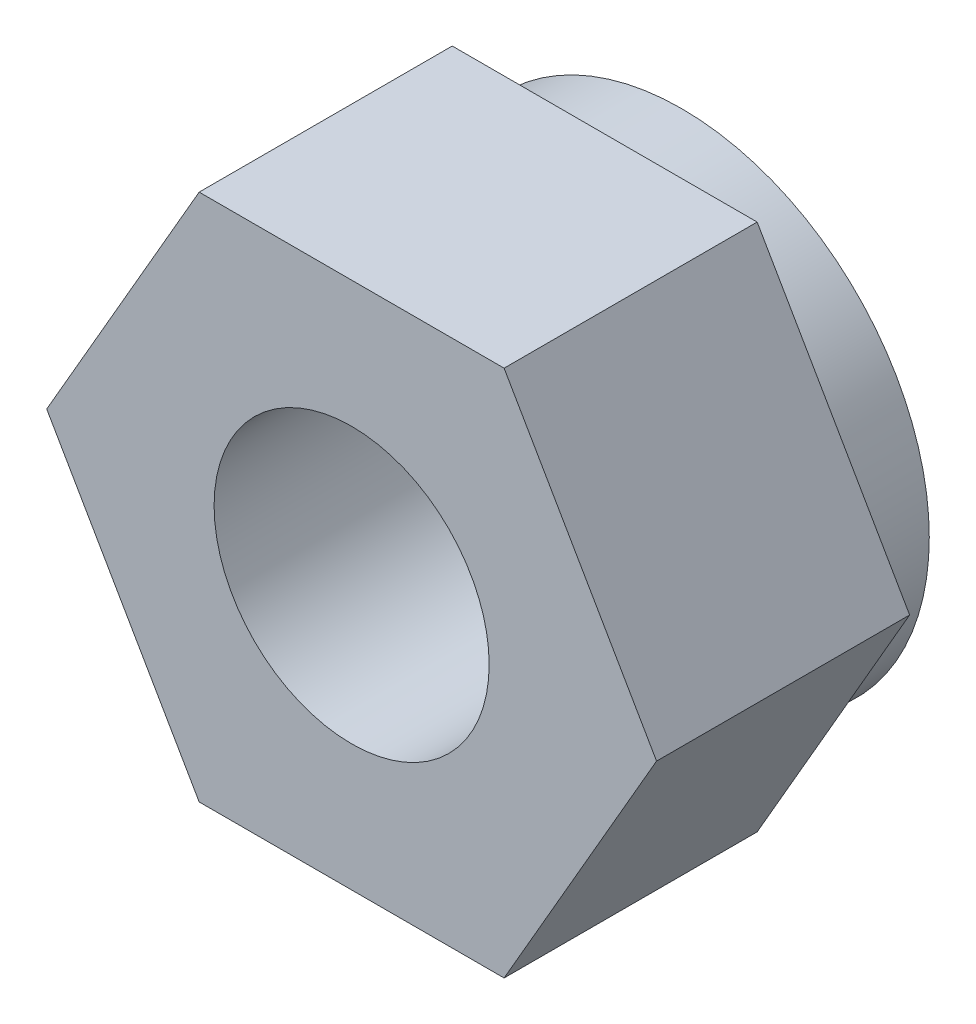
ISO-10303-21;
HEADER;
FILE_DESCRIPTION(('STEP AP214'),'2;1');
FILE_NAME('part.step','',(''),(''),'','','');
FILE_SCHEMA(('AUTOMOTIVE_DESIGN { 1 0 10303 214 1 1 1 1 }'));
ENDSEC;
DATA;
#1=APPLICATION_CONTEXT('core data for automotive mechanical design processes');
#2=APPLICATION_PROTOCOL_DEFINITION('international standard','automotive_design',2000,#1);
#3=PRODUCT_CONTEXT('',#1,'mechanical');
#4=PRODUCT('Part','Part','',(#3));
#5=PRODUCT_RELATED_PRODUCT_CATEGORY('part','',(#4));
#6=PRODUCT_DEFINITION_FORMATION('','',#4);
#7=PRODUCT_DEFINITION_CONTEXT('part definition',#1,'design');
#8=PRODUCT_DEFINITION('design','',#6,#7);
#9=PRODUCT_DEFINITION_SHAPE('','',#8);
#10=(LENGTH_UNIT() NAMED_UNIT(*) SI_UNIT(.MILLI.,.METRE.));
#11=(NAMED_UNIT(*) PLANE_ANGLE_UNIT() SI_UNIT($,.RADIAN.));
#12=(NAMED_UNIT(*) SI_UNIT($,.STERADIAN.) SOLID_ANGLE_UNIT());
#13=UNCERTAINTY_MEASURE_WITH_UNIT(LENGTH_MEASURE(1.E-05),#10,'distance_accuracy_value','');
#14=(GEOMETRIC_REPRESENTATION_CONTEXT(3) GLOBAL_UNCERTAINTY_ASSIGNED_CONTEXT((#13)) GLOBAL_UNIT_ASSIGNED_CONTEXT((#10,
#11,#12)) REPRESENTATION_CONTEXT('',''));
#15=CARTESIAN_POINT('',(0.,0.,0.));
#16=DIRECTION('',(0.,0.,1.));
#17=DIRECTION('',(1.,0.,0.));
#18=AXIS2_PLACEMENT_3D('',#15,#16,#17);
#19=CARTESIAN_POINT('',(0.,0.,2.3));
#20=DIRECTION('',(0.,0.,1.));
#21=DIRECTION('',(1.,0.,0.));
#22=AXIS2_PLACEMENT_3D('',#19,#20,#21);
#23=PLANE('',#22);
#24=DIRECTION('',(-1.,0.,0.));
#25=VECTOR('',#24,1.);
#26=CARTESIAN_POINT('',(1.3856406460551,2.4,2.3));
#27=LINE('',#26,#25);
#28=CARTESIAN_POINT('',(1.3856406460551,2.4,2.3));
#29=VERTEX_POINT('',#28);
#30=CARTESIAN_POINT('',(-1.3856406460551,2.4,2.3));
#31=VERTEX_POINT('',#30);
#32=EDGE_CURVE('E139',#29,#31,#27,.T.);
#33=ORIENTED_EDGE('',*,*,#32,.T.);
#34=DIRECTION('',(-0.5,-0.866025403784438,0.));
#35=VECTOR('',#34,1.);
#36=CARTESIAN_POINT('',(-1.3856406460551,2.4,2.3));
#37=LINE('',#36,#35);
#38=CARTESIAN_POINT('',(-2.77128129211021,0.,2.3));
#39=VERTEX_POINT('',#38);
#40=EDGE_CURVE('E97',#31,#39,#37,.T.);
#41=ORIENTED_EDGE('',*,*,#40,.T.);
#42=DIRECTION('',(0.5,-0.866025403784439,0.));
#43=VECTOR('',#42,1.);
#44=CARTESIAN_POINT('',(-2.77128129211021,0.,2.3));
#45=LINE('',#44,#43);
#46=CARTESIAN_POINT('',(-1.3856406460551,-2.4,2.3));
#47=VERTEX_POINT('',#46);
#48=EDGE_CURVE('E110',#39,#47,#45,.T.);
#49=ORIENTED_EDGE('',*,*,#48,.T.);
#50=DIRECTION('',(1.,0.,0.));
#51=VECTOR('',#50,1.);
#52=CARTESIAN_POINT('',(-1.3856406460551,-2.4,2.3));
#53=LINE('',#52,#51);
#54=CARTESIAN_POINT('',(1.3856406460551,-2.4,2.3));
#55=VERTEX_POINT('',#54);
#56=EDGE_CURVE('E104',#47,#55,#53,.T.);
#57=ORIENTED_EDGE('',*,*,#56,.T.);
#58=DIRECTION('',(0.5,0.866025403784439,0.));
#59=VECTOR('',#58,1.);
#60=CARTESIAN_POINT('',(1.3856406460551,-2.4,2.3));
#61=LINE('',#60,#59);
#62=CARTESIAN_POINT('',(2.77128129211021,0.,2.3));
#63=VERTEX_POINT('',#62);
#64=EDGE_CURVE('E108',#55,#63,#61,.T.);
#65=ORIENTED_EDGE('',*,*,#64,.T.);
#66=DIRECTION('',(-0.5,0.866025403784439,0.));
#67=VECTOR('',#66,1.);
#68=CARTESIAN_POINT('',(2.77128129211021,0.,2.3));
#69=LINE('',#68,#67);
#70=EDGE_CURVE('E59',#63,#29,#69,.T.);
#71=ORIENTED_EDGE('',*,*,#70,.T.);
#72=EDGE_LOOP('',(#33,#41,#49,#57,#65,#71));
#73=FACE_BOUND('',#72,.T.);
#74=CARTESIAN_POINT('',(0.,0.,2.3));
#75=DIRECTION('',(0.,0.,1.));
#76=DIRECTION('',(1.,0.,0.));
#77=AXIS2_PLACEMENT_3D('',#74,#75,#76);
#78=CIRCLE('',#77,1.25);
#79=CARTESIAN_POINT('',(1.25,0.,2.3));
#80=VERTEX_POINT('',#79);
#81=EDGE_CURVE('E132',#80,#80,#78,.T.);
#82=ORIENTED_EDGE('',*,*,#81,.F.);
#83=EDGE_LOOP('',(#82));
#84=FACE_BOUND('',#83,.T.);
#85=ADVANCED_FACE('F41',(#73,#84),#23,.T.);
#86=CARTESIAN_POINT('',(0.,0.,0.));
#87=DIRECTION('',(0.,0.,1.));
#88=DIRECTION('',(1.,0.,0.));
#89=AXIS2_PLACEMENT_3D('',#86,#87,#88);
#90=PLANE('',#89);
#91=CARTESIAN_POINT('',(0.,0.,0.));
#92=DIRECTION('',(0.,0.,-1.));
#93=DIRECTION('',(-1.,0.,0.));
#94=AXIS2_PLACEMENT_3D('',#91,#92,#93);
#95=CIRCLE('',#94,2.25);
#96=CARTESIAN_POINT('',(-2.25,0.,0.));
#97=VERTEX_POINT('',#96);
#98=EDGE_CURVE('E11',#97,#97,#95,.T.);
#99=ORIENTED_EDGE('',*,*,#98,.F.);
#100=EDGE_LOOP('',(#99));
#101=FACE_BOUND('',#100,.T.);
#102=DIRECTION('',(-1.,0.,0.));
#103=VECTOR('',#102,1.);
#104=CARTESIAN_POINT('',(1.3856406460551,2.4,0.));
#105=LINE('',#104,#103);
#106=CARTESIAN_POINT('',(1.3856406460551,2.4,0.));
#107=VERTEX_POINT('',#106);
#108=CARTESIAN_POINT('',(-1.3856406460551,2.4,0.));
#109=VERTEX_POINT('',#108);
#110=EDGE_CURVE('E128',#107,#109,#105,.T.);
#111=ORIENTED_EDGE('',*,*,#110,.F.);
#112=DIRECTION('',(-0.5,0.866025403784439,0.));
#113=VECTOR('',#112,1.);
#114=CARTESIAN_POINT('',(2.77128129211021,0.,0.));
#115=LINE('',#114,#113);
#116=CARTESIAN_POINT('',(2.77128129211021,0.,0.));
#117=VERTEX_POINT('',#116);
#118=EDGE_CURVE('E88',#117,#107,#115,.T.);
#119=ORIENTED_EDGE('',*,*,#118,.F.);
#120=DIRECTION('',(0.5,0.866025403784439,0.));
#121=VECTOR('',#120,1.);
#122=CARTESIAN_POINT('',(1.3856406460551,-2.4,0.));
#123=LINE('',#122,#121);
#124=CARTESIAN_POINT('',(1.3856406460551,-2.4,0.));
#125=VERTEX_POINT('',#124);
#126=EDGE_CURVE('E82',#125,#117,#123,.T.);
#127=ORIENTED_EDGE('',*,*,#126,.F.);
#128=DIRECTION('',(1.,0.,0.));
#129=VECTOR('',#128,1.);
#130=CARTESIAN_POINT('',(-1.3856406460551,-2.4,0.));
#131=LINE('',#130,#129);
#132=CARTESIAN_POINT('',(-1.3856406460551,-2.4,0.));
#133=VERTEX_POINT('',#132);
#134=EDGE_CURVE('E118',#133,#125,#131,.T.);
#135=ORIENTED_EDGE('',*,*,#134,.F.);
#136=DIRECTION('',(0.5,-0.866025403784439,0.));
#137=VECTOR('',#136,1.);
#138=CARTESIAN_POINT('',(-2.77128129211021,0.,0.));
#139=LINE('',#138,#137);
#140=CARTESIAN_POINT('',(-2.77128129211021,0.,0.));
#141=VERTEX_POINT('',#140);
#142=EDGE_CURVE('E134',#141,#133,#139,.T.);
#143=ORIENTED_EDGE('',*,*,#142,.F.);
#144=DIRECTION('',(-0.5,-0.866025403784438,0.));
#145=VECTOR('',#144,1.);
#146=CARTESIAN_POINT('',(-1.3856406460551,2.4,0.));
#147=LINE('',#146,#145);
#148=EDGE_CURVE('E131',#109,#141,#147,.T.);
#149=ORIENTED_EDGE('',*,*,#148,.F.);
#150=EDGE_LOOP('',(#111,#119,#127,#135,#143,#149));
#151=FACE_BOUND('',#150,.T.);
#152=ADVANCED_FACE('F152',(#101,#151),#90,.F.);
#153=CARTESIAN_POINT('',(1.3856406460551,2.4,2.3));
#154=DIRECTION('',(0.,-1.,0.));
#155=DIRECTION('',(0.,0.,-1.));
#156=AXIS2_PLACEMENT_3D('',#153,#154,#155);
#157=PLANE('',#156);
#158=ORIENTED_EDGE('',*,*,#110,.T.);
#159=DIRECTION('',(0.,0.,-1.));
#160=VECTOR('',#159,1.);
#161=CARTESIAN_POINT('',(-1.3856406460551,2.4,2.3));
#162=LINE('',#161,#160);
#163=EDGE_CURVE('E45',#31,#109,#162,.T.);
#164=ORIENTED_EDGE('',*,*,#163,.F.);
#165=ORIENTED_EDGE('',*,*,#32,.F.);
#166=DIRECTION('',(0.,0.,-1.));
#167=VECTOR('',#166,1.);
#168=CARTESIAN_POINT('',(1.3856406460551,2.4,2.3));
#169=LINE('',#168,#167);
#170=EDGE_CURVE('E124',#29,#107,#169,.T.);
#171=ORIENTED_EDGE('',*,*,#170,.T.);
#172=EDGE_LOOP('',(#158,#164,#165,#171));
#173=FACE_BOUND('',#172,.T.);
#174=ADVANCED_FACE('F43',(#173),#157,.F.);
#175=CARTESIAN_POINT('',(-1.3856406460551,2.4,2.3));
#176=DIRECTION('',(0.866025403784438,-0.5,0.));
#177=DIRECTION('',(0.5,0.866025403784438,0.));
#178=AXIS2_PLACEMENT_3D('',#175,#176,#177);
#179=PLANE('',#178);
#180=ORIENTED_EDGE('',*,*,#148,.T.);
#181=DIRECTION('',(0.,0.,-1.));
#182=VECTOR('',#181,1.);
#183=CARTESIAN_POINT('',(-2.77128129211021,0.,2.3));
#184=LINE('',#183,#182);
#185=EDGE_CURVE('E142',#39,#141,#184,.T.);
#186=ORIENTED_EDGE('',*,*,#185,.F.);
#187=ORIENTED_EDGE('',*,*,#40,.F.);
#188=ORIENTED_EDGE('',*,*,#163,.T.);
#189=EDGE_LOOP('',(#180,#186,#187,#188));
#190=FACE_BOUND('',#189,.T.);
#191=ADVANCED_FACE('F147',(#190),#179,.F.);
#192=CARTESIAN_POINT('',(-2.77128129211021,0.,2.3));
#193=DIRECTION('',(0.866025403784439,0.5,0.));
#194=DIRECTION('',(-0.5,0.866025403784439,0.));
#195=AXIS2_PLACEMENT_3D('',#192,#193,#194);
#196=PLANE('',#195);
#197=ORIENTED_EDGE('',*,*,#142,.T.);
#198=DIRECTION('',(0.,0.,-1.));
#199=VECTOR('',#198,1.);
#200=CARTESIAN_POINT('',(-1.3856406460551,-2.4,2.3));
#201=LINE('',#200,#199);
#202=EDGE_CURVE('E119',#47,#133,#201,.T.);
#203=ORIENTED_EDGE('',*,*,#202,.F.);
#204=ORIENTED_EDGE('',*,*,#48,.F.);
#205=ORIENTED_EDGE('',*,*,#185,.T.);
#206=EDGE_LOOP('',(#197,#203,#204,#205));
#207=FACE_BOUND('',#206,.T.);
#208=ADVANCED_FACE('F153',(#207),#196,.F.);
#209=CARTESIAN_POINT('',(-1.3856406460551,-2.4,2.3));
#210=DIRECTION('',(0.,1.,0.));
#211=DIRECTION('',(0.,0.,1.));
#212=AXIS2_PLACEMENT_3D('',#209,#210,#211);
#213=PLANE('',#212);
#214=ORIENTED_EDGE('',*,*,#134,.T.);
#215=DIRECTION('',(0.,0.,-1.));
#216=VECTOR('',#215,1.);
#217=CARTESIAN_POINT('',(1.3856406460551,-2.4,2.3));
#218=LINE('',#217,#216);
#219=EDGE_CURVE('E115',#55,#125,#218,.T.);
#220=ORIENTED_EDGE('',*,*,#219,.F.);
#221=ORIENTED_EDGE('',*,*,#56,.F.);
#222=ORIENTED_EDGE('',*,*,#202,.T.);
#223=EDGE_LOOP('',(#214,#220,#221,#222));
#224=FACE_BOUND('',#223,.T.);
#225=ADVANCED_FACE('F116',(#224),#213,.F.);
#226=CARTESIAN_POINT('',(1.3856406460551,-2.4,2.3));
#227=DIRECTION('',(-0.866025403784439,0.5,0.));
#228=DIRECTION('',(-0.5,-0.866025403784438,0.));
#229=AXIS2_PLACEMENT_3D('',#226,#227,#228);
#230=PLANE('',#229);
#231=ORIENTED_EDGE('',*,*,#126,.T.);
#232=DIRECTION('',(0.,0.,-1.));
#233=VECTOR('',#232,1.);
#234=CARTESIAN_POINT('',(2.77128129211021,0.,2.3));
#235=LINE('',#234,#233);
#236=EDGE_CURVE('E120',#63,#117,#235,.T.);
#237=ORIENTED_EDGE('',*,*,#236,.F.);
#238=ORIENTED_EDGE('',*,*,#64,.F.);
#239=ORIENTED_EDGE('',*,*,#219,.T.);
#240=EDGE_LOOP('',(#231,#237,#238,#239));
#241=FACE_BOUND('',#240,.T.);
#242=ADVANCED_FACE('F122',(#241),#230,.F.);
#243=CARTESIAN_POINT('',(2.77128129211021,0.,2.3));
#244=DIRECTION('',(-0.866025403784439,-0.5,0.));
#245=DIRECTION('',(0.5,-0.866025403784439,0.));
#246=AXIS2_PLACEMENT_3D('',#243,#244,#245);
#247=PLANE('',#246);
#248=ORIENTED_EDGE('',*,*,#118,.T.);
#249=ORIENTED_EDGE('',*,*,#170,.F.);
#250=ORIENTED_EDGE('',*,*,#70,.F.);
#251=ORIENTED_EDGE('',*,*,#236,.T.);
#252=EDGE_LOOP('',(#248,#249,#250,#251));
#253=FACE_BOUND('',#252,.T.);
#254=ADVANCED_FACE('F179',(#253),#247,.F.);
#255=CARTESIAN_POINT('',(0.,0.,2.3));
#256=DIRECTION('',(0.,0.,-1.));
#257=DIRECTION('',(-1.,0.,0.));
#258=AXIS2_PLACEMENT_3D('',#255,#256,#257);
#259=CYLINDRICAL_SURFACE('',#258,1.25);
#260=ORIENTED_EDGE('',*,*,#81,.T.);
#261=EDGE_LOOP('',(#260));
#262=FACE_BOUND('',#261,.T.);
#263=CARTESIAN_POINT('',(0.,0.,-0.7));
#264=DIRECTION('',(0.,0.,-1.));
#265=DIRECTION('',(-1.,0.,0.));
#266=AXIS2_PLACEMENT_3D('',#263,#264,#265);
#267=CIRCLE('',#266,1.25);
#268=CARTESIAN_POINT('',(-1.25,0.,-0.7));
#269=VERTEX_POINT('',#268);
#270=EDGE_CURVE('E162',#269,#269,#267,.T.);
#271=ORIENTED_EDGE('',*,*,#270,.T.);
#272=EDGE_LOOP('',(#271));
#273=FACE_BOUND('',#272,.T.);
#274=ADVANCED_FACE('F166',(#262,#273),#259,.F.);
#275=CARTESIAN_POINT('',(0.,0.,-0.7));
#276=DIRECTION('',(0.,0.,-1.));
#277=DIRECTION('',(-1.,0.,0.));
#278=AXIS2_PLACEMENT_3D('',#275,#276,#277);
#279=PLANE('',#278);
#280=CARTESIAN_POINT('',(0.,0.,-0.7));
#281=DIRECTION('',(0.,0.,-1.));
#282=DIRECTION('',(-1.,0.,0.));
#283=AXIS2_PLACEMENT_3D('',#280,#281,#282);
#284=CIRCLE('',#283,2.25);
#285=CARTESIAN_POINT('',(-2.25,0.,-0.7));
#286=VERTEX_POINT('',#285);
#287=EDGE_CURVE('E158',#286,#286,#284,.T.);
#288=ORIENTED_EDGE('',*,*,#287,.T.);
#289=EDGE_LOOP('',(#288));
#290=FACE_BOUND('',#289,.T.);
#291=ORIENTED_EDGE('',*,*,#270,.F.);
#292=EDGE_LOOP('',(#291));
#293=FACE_BOUND('',#292,.T.);
#294=ADVANCED_FACE('F168',(#290,#293),#279,.T.);
#295=CARTESIAN_POINT('',(0.,0.,-0.7));
#296=DIRECTION('',(0.,0.,1.));
#297=DIRECTION('',(1.,0.,0.));
#298=AXIS2_PLACEMENT_3D('',#295,#296,#297);
#299=CYLINDRICAL_SURFACE('',#298,2.25);
#300=ORIENTED_EDGE('',*,*,#287,.F.);
#301=EDGE_LOOP('',(#300));
#302=FACE_BOUND('',#301,.T.);
#303=ORIENTED_EDGE('',*,*,#98,.T.);
#304=EDGE_LOOP('',(#303));
#305=FACE_BOUND('',#304,.T.);
#306=ADVANCED_FACE('F170',(#302,#305),#299,.T.);
#307=CLOSED_SHELL('',(#85,#152,#174,#191,#208,#225,#242,#254,#274,#294,#306));
#308=MANIFOLD_SOLID_BREP('B2',#307);
#309=ADVANCED_BREP_SHAPE_REPRESENTATION('',(#18,#308),#14);
#310=SHAPE_DEFINITION_REPRESENTATION(#9,#309);
ENDSEC;
END-ISO-10303-21;
